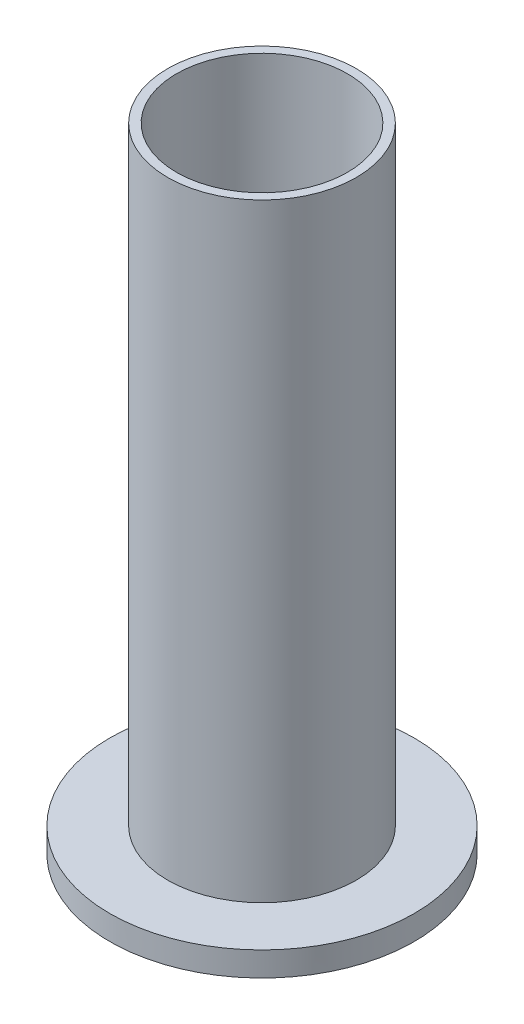
ISO-10303-21;
HEADER;
FILE_DESCRIPTION(('STEP AP214'),'2;1');
FILE_NAME('part.step','',(''),(''),'','','');
FILE_SCHEMA(('AUTOMOTIVE_DESIGN { 1 0 10303 214 1 1 1 1 }'));
ENDSEC;
DATA;
#1=APPLICATION_CONTEXT('core data for automotive mechanical design processes');
#2=APPLICATION_PROTOCOL_DEFINITION('international standard','automotive_design',2000,#1);
#3=PRODUCT_CONTEXT('',#1,'mechanical');
#4=PRODUCT('Part','Part','',(#3));
#5=PRODUCT_RELATED_PRODUCT_CATEGORY('part','',(#4));
#6=PRODUCT_DEFINITION_FORMATION('','',#4);
#7=PRODUCT_DEFINITION_CONTEXT('part definition',#1,'design');
#8=PRODUCT_DEFINITION('design','',#6,#7);
#9=PRODUCT_DEFINITION_SHAPE('','',#8);
#10=(LENGTH_UNIT() NAMED_UNIT(*) SI_UNIT(.MILLI.,.METRE.));
#11=(NAMED_UNIT(*) PLANE_ANGLE_UNIT() SI_UNIT($,.RADIAN.));
#12=(NAMED_UNIT(*) SI_UNIT($,.STERADIAN.) SOLID_ANGLE_UNIT());
#13=UNCERTAINTY_MEASURE_WITH_UNIT(LENGTH_MEASURE(1.E-05),#10,'distance_accuracy_value','');
#14=(GEOMETRIC_REPRESENTATION_CONTEXT(3) GLOBAL_UNCERTAINTY_ASSIGNED_CONTEXT((#13)) GLOBAL_UNIT_ASSIGNED_CONTEXT((#10,
#11,#12)) REPRESENTATION_CONTEXT('',''));
#15=CARTESIAN_POINT('',(0.,0.,0.));
#16=DIRECTION('',(0.,0.,1.));
#17=DIRECTION('',(1.,0.,0.));
#18=AXIS2_PLACEMENT_3D('',#15,#16,#17);
#19=CARTESIAN_POINT('',(0.,12.,0.));
#20=DIRECTION('',(0.,-1.,0.));
#21=DIRECTION('',(0.,0.,-1.));
#22=AXIS2_PLACEMENT_3D('',#19,#20,#21);
#23=CYLINDRICAL_SURFACE('',#22,12.5);
#24=CARTESIAN_POINT('',(0.,12.,0.));
#25=DIRECTION('',(0.,1.,0.));
#26=DIRECTION('',(0.,0.,1.));
#27=AXIS2_PLACEMENT_3D('',#24,#25,#26);
#28=CIRCLE('',#27,12.5);
#29=CARTESIAN_POINT('',(0.,12.,12.5));
#30=VERTEX_POINT('',#29);
#31=EDGE_CURVE('E10',#30,#30,#28,.T.);
#32=ORIENTED_EDGE('',*,*,#31,.F.);
#33=EDGE_LOOP('',(#32));
#34=FACE_BOUND('',#33,.T.);
#35=CARTESIAN_POINT('',(0.,10.,0.));
#36=DIRECTION('',(0.,-1.,0.));
#37=DIRECTION('',(0.,0.,-1.));
#38=AXIS2_PLACEMENT_3D('',#35,#36,#37);
#39=CIRCLE('',#38,12.5);
#40=CARTESIAN_POINT('',(0.,10.,-12.5));
#41=VERTEX_POINT('',#40);
#42=EDGE_CURVE('E48',#41,#41,#39,.T.);
#43=ORIENTED_EDGE('',*,*,#42,.F.);
#44=EDGE_LOOP('',(#43));
#45=FACE_BOUND('',#44,.T.);
#46=ADVANCED_FACE('F33',(#34,#45),#23,.T.);
#47=CARTESIAN_POINT('',(0.,12.,0.));
#48=DIRECTION('',(0.,1.,0.));
#49=DIRECTION('',(0.,0.,1.));
#50=AXIS2_PLACEMENT_3D('',#47,#48,#49);
#51=PLANE('',#50);
#52=CARTESIAN_POINT('',(0.,12.,0.));
#53=DIRECTION('',(0.,1.,0.));
#54=DIRECTION('',(0.,0.,1.));
#55=AXIS2_PLACEMENT_3D('',#52,#53,#54);
#56=CIRCLE('',#55,7.75);
#57=CARTESIAN_POINT('',(0.,12.,7.75));
#58=VERTEX_POINT('',#57);
#59=EDGE_CURVE('E43',#58,#58,#56,.T.);
#60=ORIENTED_EDGE('',*,*,#59,.F.);
#61=EDGE_LOOP('',(#60));
#62=FACE_BOUND('',#61,.T.);
#63=ORIENTED_EDGE('',*,*,#31,.T.);
#64=EDGE_LOOP('',(#63));
#65=FACE_BOUND('',#64,.T.);
#66=ADVANCED_FACE('F78',(#62,#65),#51,.T.);
#67=CARTESIAN_POINT('',(0.,62.,0.));
#68=DIRECTION('',(0.,-1.,0.));
#69=DIRECTION('',(0.,0.,-1.));
#70=AXIS2_PLACEMENT_3D('',#67,#68,#69);
#71=CYLINDRICAL_SURFACE('',#70,7.75);
#72=CARTESIAN_POINT('',(0.,62.,0.));
#73=DIRECTION('',(0.,1.,0.));
#74=DIRECTION('',(0.,0.,1.));
#75=AXIS2_PLACEMENT_3D('',#72,#73,#74);
#76=CIRCLE('',#75,7.75);
#77=CARTESIAN_POINT('',(0.,62.,7.75));
#78=VERTEX_POINT('',#77);
#79=EDGE_CURVE('E39',#78,#78,#76,.T.);
#80=ORIENTED_EDGE('',*,*,#79,.F.);
#81=EDGE_LOOP('',(#80));
#82=FACE_BOUND('',#81,.T.);
#83=ORIENTED_EDGE('',*,*,#59,.T.);
#84=EDGE_LOOP('',(#83));
#85=FACE_BOUND('',#84,.T.);
#86=ADVANCED_FACE('F70',(#82,#85),#71,.T.);
#87=CARTESIAN_POINT('',(0.,62.,0.));
#88=DIRECTION('',(0.,1.,0.));
#89=DIRECTION('',(0.,0.,1.));
#90=AXIS2_PLACEMENT_3D('',#87,#88,#89);
#91=PLANE('',#90);
#92=CARTESIAN_POINT('',(0.,62.,0.));
#93=DIRECTION('',(0.,1.,0.));
#94=DIRECTION('',(0.,0.,1.));
#95=AXIS2_PLACEMENT_3D('',#92,#93,#94);
#96=CIRCLE('',#95,7.02391582947973);
#97=CARTESIAN_POINT('',(0.,62.,7.02391582947973));
#98=VERTEX_POINT('',#97);
#99=EDGE_CURVE('E53',#98,#98,#96,.T.);
#100=ORIENTED_EDGE('',*,*,#99,.F.);
#101=EDGE_LOOP('',(#100));
#102=FACE_BOUND('',#101,.T.);
#103=ORIENTED_EDGE('',*,*,#79,.T.);
#104=EDGE_LOOP('',(#103));
#105=FACE_BOUND('',#104,.T.);
#106=ADVANCED_FACE('F68',(#102,#105),#91,.T.);
#107=CARTESIAN_POINT('',(0.,10.,0.));
#108=DIRECTION('',(0.,-1.,0.));
#109=DIRECTION('',(0.,0.,-1.));
#110=AXIS2_PLACEMENT_3D('',#107,#108,#109);
#111=PLANE('',#110);
#112=ORIENTED_EDGE('',*,*,#42,.T.);
#113=EDGE_LOOP('',(#112));
#114=FACE_BOUND('',#113,.T.);
#115=ADVANCED_FACE('F64',(#114),#111,.T.);
#116=CARTESIAN_POINT('',(0.,32.,0.));
#117=DIRECTION('',(0.,1.,0.));
#118=DIRECTION('',(0.,0.,1.));
#119=AXIS2_PLACEMENT_3D('',#116,#117,#118);
#120=CYLINDRICAL_SURFACE('',#119,7.02391582947973);
#121=CARTESIAN_POINT('',(0.,32.,0.));
#122=DIRECTION('',(0.,1.,0.));
#123=DIRECTION('',(0.,0.,1.));
#124=AXIS2_PLACEMENT_3D('',#121,#122,#123);
#125=CIRCLE('',#124,7.02391582947973);
#126=CARTESIAN_POINT('',(0.,32.,7.02391582947973));
#127=VERTEX_POINT('',#126);
#128=EDGE_CURVE('E52',#127,#127,#125,.T.);
#129=ORIENTED_EDGE('',*,*,#128,.F.);
#130=EDGE_LOOP('',(#129));
#131=FACE_BOUND('',#130,.T.);
#132=ORIENTED_EDGE('',*,*,#99,.T.);
#133=EDGE_LOOP('',(#132));
#134=FACE_BOUND('',#133,.T.);
#135=ADVANCED_FACE('F61',(#131,#134),#120,.F.);
#136=CARTESIAN_POINT('',(0.,32.,0.));
#137=DIRECTION('',(0.,1.,0.));
#138=DIRECTION('',(0.,0.,1.));
#139=AXIS2_PLACEMENT_3D('',#136,#137,#138);
#140=PLANE('',#139);
#141=ORIENTED_EDGE('',*,*,#128,.T.);
#142=EDGE_LOOP('',(#141));
#143=FACE_BOUND('',#142,.T.);
#144=ADVANCED_FACE('F59',(#143),#140,.T.);
#145=CLOSED_SHELL('',(#46,#66,#86,#106,#115,#135,#144));
#146=MANIFOLD_SOLID_BREP('B2',#145);
#147=ADVANCED_BREP_SHAPE_REPRESENTATION('',(#18,#146),#14);
#148=SHAPE_DEFINITION_REPRESENTATION(#9,#147);
ENDSEC;
END-ISO-10303-21;
